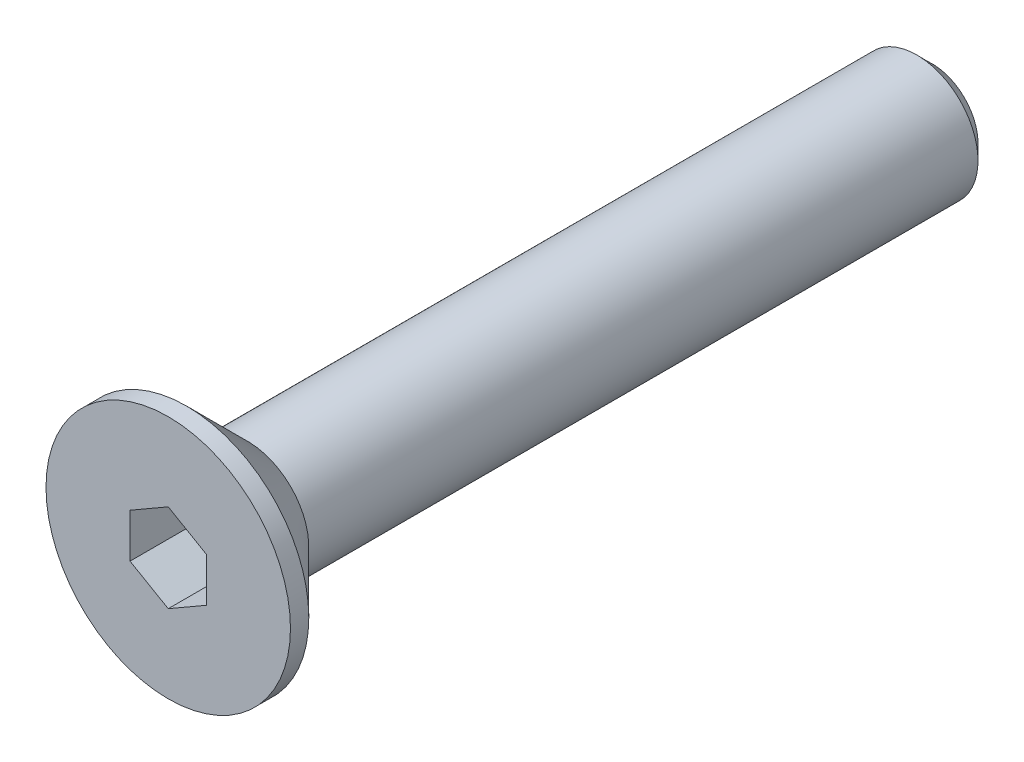
ISO-10303-21;
HEADER;
FILE_DESCRIPTION(('STEP AP214'),'2;1');
FILE_NAME('part.step','',(''),(''),'','','');
FILE_SCHEMA(('AUTOMOTIVE_DESIGN { 1 0 10303 214 1 1 1 1 }'));
ENDSEC;
DATA;
#1=APPLICATION_CONTEXT('core data for automotive mechanical design processes');
#2=APPLICATION_PROTOCOL_DEFINITION('international standard','automotive_design',2000,#1);
#3=PRODUCT_CONTEXT('',#1,'mechanical');
#4=PRODUCT('Part','Part','',(#3));
#5=PRODUCT_RELATED_PRODUCT_CATEGORY('part','',(#4));
#6=PRODUCT_DEFINITION_FORMATION('','',#4);
#7=PRODUCT_DEFINITION_CONTEXT('part definition',#1,'design');
#8=PRODUCT_DEFINITION('design','',#6,#7);
#9=PRODUCT_DEFINITION_SHAPE('','',#8);
#10=(LENGTH_UNIT() NAMED_UNIT(*) SI_UNIT(.MILLI.,.METRE.));
#11=(NAMED_UNIT(*) PLANE_ANGLE_UNIT() SI_UNIT($,.RADIAN.));
#12=(NAMED_UNIT(*) SI_UNIT($,.STERADIAN.) SOLID_ANGLE_UNIT());
#13=UNCERTAINTY_MEASURE_WITH_UNIT(LENGTH_MEASURE(1.E-05),#10,'distance_accuracy_value','');
#14=(GEOMETRIC_REPRESENTATION_CONTEXT(3) GLOBAL_UNCERTAINTY_ASSIGNED_CONTEXT((#13)) GLOBAL_UNIT_ASSIGNED_CONTEXT((#10,
#11,#12)) REPRESENTATION_CONTEXT('',''));
#15=CARTESIAN_POINT('',(0.,0.,0.));
#16=DIRECTION('',(0.,0.,1.));
#17=DIRECTION('',(1.,0.,0.));
#18=AXIS2_PLACEMENT_3D('',#15,#16,#17);
#19=CARTESIAN_POINT('',(0.,0.,12.5));
#20=DIRECTION('',(0.,0.,1.));
#21=DIRECTION('',(1.,0.,0.));
#22=AXIS2_PLACEMENT_3D('',#19,#20,#21);
#23=PLANE('',#22);
#24=DIRECTION('',(-0.866025403784439,0.5,0.));
#25=VECTOR('',#24,1.);
#26=CARTESIAN_POINT('',(1.25,0.721687836487034,12.5));
#27=LINE('',#26,#25);
#28=CARTESIAN_POINT('',(1.25,0.721687836487034,12.5));
#29=VERTEX_POINT('',#28);
#30=CARTESIAN_POINT('',(0.,1.44337567297407,12.5));
#31=VERTEX_POINT('',#30);
#32=EDGE_CURVE('E53',#29,#31,#27,.T.);
#33=ORIENTED_EDGE('',*,*,#32,.F.);
#34=DIRECTION('',(0.,1.,0.));
#35=VECTOR('',#34,1.);
#36=CARTESIAN_POINT('',(1.25,-0.721687836487031,12.5));
#37=LINE('',#36,#35);
#38=CARTESIAN_POINT('',(1.25,-0.721687836487031,12.5));
#39=VERTEX_POINT('',#38);
#40=EDGE_CURVE('E136',#39,#29,#37,.T.);
#41=ORIENTED_EDGE('',*,*,#40,.F.);
#42=DIRECTION('',(0.866025403784439,0.5,0.));
#43=VECTOR('',#42,1.);
#44=CARTESIAN_POINT('',(0.,-1.44337567297406,12.5));
#45=LINE('',#44,#43);
#46=CARTESIAN_POINT('',(0.,-1.44337567297406,12.5));
#47=VERTEX_POINT('',#46);
#48=EDGE_CURVE('E134',#47,#39,#45,.T.);
#49=ORIENTED_EDGE('',*,*,#48,.F.);
#50=DIRECTION('',(0.866025403784439,-0.5,0.));
#51=VECTOR('',#50,1.);
#52=CARTESIAN_POINT('',(-1.25,-0.721687836487031,12.5));
#53=LINE('',#52,#51);
#54=CARTESIAN_POINT('',(-1.25,-0.721687836487031,12.5));
#55=VERTEX_POINT('',#54);
#56=EDGE_CURVE('E101',#55,#47,#53,.T.);
#57=ORIENTED_EDGE('',*,*,#56,.F.);
#58=DIRECTION('',(0.,-1.,0.));
#59=VECTOR('',#58,1.);
#60=CARTESIAN_POINT('',(-1.25,0.721687836487034,12.5));
#61=LINE('',#60,#59);
#62=CARTESIAN_POINT('',(-1.25,0.721687836487034,12.5));
#63=VERTEX_POINT('',#62);
#64=EDGE_CURVE('E130',#63,#55,#61,.T.);
#65=ORIENTED_EDGE('',*,*,#64,.F.);
#66=DIRECTION('',(-0.866025403784439,-0.5,0.));
#67=VECTOR('',#66,1.);
#68=CARTESIAN_POINT('',(0.,1.44337567297407,12.5));
#69=LINE('',#68,#67);
#70=EDGE_CURVE('E127',#31,#63,#69,.T.);
#71=ORIENTED_EDGE('',*,*,#70,.F.);
#72=EDGE_LOOP('',(#33,#41,#49,#57,#65,#71));
#73=FACE_BOUND('',#72,.T.);
#74=CARTESIAN_POINT('',(0.,0.,12.5));
#75=DIRECTION('',(0.,0.,-1.));
#76=DIRECTION('',(-1.,0.,0.));
#77=AXIS2_PLACEMENT_3D('',#74,#75,#76);
#78=CIRCLE('',#77,4.);
#79=CARTESIAN_POINT('',(-4.,0.,12.5));
#80=VERTEX_POINT('',#79);
#81=EDGE_CURVE('E151',#80,#80,#78,.T.);
#82=ORIENTED_EDGE('',*,*,#81,.F.);
#83=EDGE_LOOP('',(#82));
#84=FACE_BOUND('',#83,.T.);
#85=ADVANCED_FACE('F37',(#73,#84),#23,.T.);
#86=CARTESIAN_POINT('',(0.,0.,-12.5));
#87=DIRECTION('',(0.,0.,-1.));
#88=DIRECTION('',(-1.,0.,0.));
#89=AXIS2_PLACEMENT_3D('',#86,#87,#88);
#90=CYLINDRICAL_SURFACE('',#89,4.);
#91=ORIENTED_EDGE('',*,*,#81,.T.);
#92=EDGE_LOOP('',(#91));
#93=FACE_BOUND('',#92,.T.);
#94=CARTESIAN_POINT('',(0.,0.,11.9));
#95=DIRECTION('',(0.,0.,-1.));
#96=DIRECTION('',(-1.,0.,0.));
#97=AXIS2_PLACEMENT_3D('',#94,#95,#96);
#98=CIRCLE('',#97,4.);
#99=CARTESIAN_POINT('',(-4.,0.,11.9));
#100=VERTEX_POINT('',#99);
#101=EDGE_CURVE('E148',#100,#100,#98,.T.);
#102=ORIENTED_EDGE('',*,*,#101,.F.);
#103=EDGE_LOOP('',(#102));
#104=FACE_BOUND('',#103,.T.);
#105=ADVANCED_FACE('F171',(#93,#104),#90,.T.);
#106=CARTESIAN_POINT('',(0.,0.,9.9));
#107=DIRECTION('',(0.,0.,1.));
#108=DIRECTION('',(1.,0.,0.));
#109=AXIS2_PLACEMENT_3D('',#106,#107,#108);
#110=CONICAL_SURFACE('',#109,2.,0.78539816339745);
#111=ORIENTED_EDGE('',*,*,#101,.T.);
#112=EDGE_LOOP('',(#111));
#113=FACE_BOUND('',#112,.T.);
#114=CARTESIAN_POINT('',(0.,0.,9.9));
#115=DIRECTION('',(0.,0.,-1.));
#116=DIRECTION('',(-1.,0.,0.));
#117=AXIS2_PLACEMENT_3D('',#114,#115,#116);
#118=CIRCLE('',#117,2.);
#119=CARTESIAN_POINT('',(-2.,0.,9.9));
#120=VERTEX_POINT('',#119);
#121=EDGE_CURVE('E140',#120,#120,#118,.T.);
#122=ORIENTED_EDGE('',*,*,#121,.F.);
#123=EDGE_LOOP('',(#122));
#124=FACE_BOUND('',#123,.T.);
#125=ADVANCED_FACE('F176',(#113,#124),#110,.T.);
#126=CARTESIAN_POINT('',(0.,0.,-12.5));
#127=DIRECTION('',(0.,0.,-1.));
#128=DIRECTION('',(-1.,0.,0.));
#129=AXIS2_PLACEMENT_3D('',#126,#127,#128);
#130=CYLINDRICAL_SURFACE('',#129,2.);
#131=CARTESIAN_POINT('',(0.,0.,-12.));
#132=DIRECTION('',(0.,0.,-1.));
#133=DIRECTION('',(-1.,0.,0.));
#134=AXIS2_PLACEMENT_3D('',#131,#132,#133);
#135=CIRCLE('',#134,2.);
#136=CARTESIAN_POINT('',(-2.,0.,-12.));
#137=VERTEX_POINT('',#136);
#138=EDGE_CURVE('E11',#137,#137,#135,.F.);
#139=ORIENTED_EDGE('',*,*,#138,.T.);
#140=EDGE_LOOP('',(#139));
#141=FACE_BOUND('',#140,.T.);
#142=ORIENTED_EDGE('',*,*,#121,.T.);
#143=EDGE_LOOP('',(#142));
#144=FACE_BOUND('',#143,.T.);
#145=ADVANCED_FACE('F167',(#141,#144),#130,.T.);
#146=CARTESIAN_POINT('',(0.,2.,-12.5));
#147=DIRECTION('',(0.,0.,-1.));
#148=DIRECTION('',(-1.,0.,0.));
#149=AXIS2_PLACEMENT_3D('',#146,#147,#148);
#150=PLANE('',#149);
#151=CARTESIAN_POINT('',(0.,0.,-12.5));
#152=DIRECTION('',(0.,0.,-1.));
#153=DIRECTION('',(-1.,0.,0.));
#154=AXIS2_PLACEMENT_3D('',#151,#152,#153);
#155=CIRCLE('',#154,1.5);
#156=CARTESIAN_POINT('',(-1.5,0.,-12.5));
#157=VERTEX_POINT('',#156);
#158=EDGE_CURVE('E46',#157,#157,#155,.T.);
#159=ORIENTED_EDGE('',*,*,#158,.T.);
#160=EDGE_LOOP('',(#159));
#161=FACE_BOUND('',#160,.T.);
#162=ADVANCED_FACE('F156',(#161),#150,.T.);
#163=CARTESIAN_POINT('',(0.,0.,-12.5));
#164=DIRECTION('',(0.,0.,1.));
#165=DIRECTION('',(1.,0.,0.));
#166=AXIS2_PLACEMENT_3D('',#163,#164,#165);
#167=CONICAL_SURFACE('',#166,1.5,0.785398163397444);
#168=ORIENTED_EDGE('',*,*,#138,.F.);
#169=EDGE_LOOP('',(#168));
#170=FACE_BOUND('',#169,.T.);
#171=ORIENTED_EDGE('',*,*,#158,.F.);
#172=EDGE_LOOP('',(#171));
#173=FACE_BOUND('',#172,.T.);
#174=ADVANCED_FACE('F40',(#170,#173),#167,.T.);
#175=CARTESIAN_POINT('',(1.25,0.721687836487034,10.));
#176=DIRECTION('',(0.5,0.866025403784439,0.));
#177=DIRECTION('',(-0.866025403784439,0.5,0.));
#178=AXIS2_PLACEMENT_3D('',#175,#176,#177);
#179=PLANE('',#178);
#180=ORIENTED_EDGE('',*,*,#32,.T.);
#181=DIRECTION('',(0.,0.,1.));
#182=VECTOR('',#181,1.);
#183=CARTESIAN_POINT('',(0.,1.44337567297407,10.));
#184=LINE('',#183,#182);
#185=CARTESIAN_POINT('',(0.,1.44337567297407,10.));
#186=VERTEX_POINT('',#185);
#187=EDGE_CURVE('E83',#186,#31,#184,.T.);
#188=ORIENTED_EDGE('',*,*,#187,.F.);
#189=DIRECTION('',(-0.866025403784439,0.5,0.));
#190=VECTOR('',#189,1.);
#191=CARTESIAN_POINT('',(1.25,0.721687836487034,10.));
#192=LINE('',#191,#190);
#193=CARTESIAN_POINT('',(1.25,0.721687836487034,10.));
#194=VERTEX_POINT('',#193);
#195=EDGE_CURVE('E138',#194,#186,#192,.T.);
#196=ORIENTED_EDGE('',*,*,#195,.F.);
#197=DIRECTION('',(0.,0.,1.));
#198=VECTOR('',#197,1.);
#199=CARTESIAN_POINT('',(1.25,0.721687836487034,10.));
#200=LINE('',#199,#198);
#201=EDGE_CURVE('E61',#194,#29,#200,.T.);
#202=ORIENTED_EDGE('',*,*,#201,.T.);
#203=EDGE_LOOP('',(#180,#188,#196,#202));
#204=FACE_BOUND('',#203,.T.);
#205=ADVANCED_FACE('F159',(#204),#179,.F.);
#206=CARTESIAN_POINT('',(1.25,-0.721687836487031,10.));
#207=DIRECTION('',(1.,0.,0.));
#208=DIRECTION('',(0.,1.,0.));
#209=AXIS2_PLACEMENT_3D('',#206,#207,#208);
#210=PLANE('',#209);
#211=ORIENTED_EDGE('',*,*,#40,.T.);
#212=ORIENTED_EDGE('',*,*,#201,.F.);
#213=DIRECTION('',(0.,1.,0.));
#214=VECTOR('',#213,1.);
#215=CARTESIAN_POINT('',(1.25,-0.721687836487031,10.));
#216=LINE('',#215,#214);
#217=CARTESIAN_POINT('',(1.25,-0.721687836487031,10.));
#218=VERTEX_POINT('',#217);
#219=EDGE_CURVE('E113',#218,#194,#216,.T.);
#220=ORIENTED_EDGE('',*,*,#219,.F.);
#221=DIRECTION('',(0.,0.,1.));
#222=VECTOR('',#221,1.);
#223=CARTESIAN_POINT('',(1.25,-0.721687836487031,10.));
#224=LINE('',#223,#222);
#225=EDGE_CURVE('E105',#218,#39,#224,.T.);
#226=ORIENTED_EDGE('',*,*,#225,.T.);
#227=EDGE_LOOP('',(#211,#212,#220,#226));
#228=FACE_BOUND('',#227,.T.);
#229=ADVANCED_FACE('F165',(#228),#210,.F.);
#230=CARTESIAN_POINT('',(0.,-1.44337567297406,10.));
#231=DIRECTION('',(0.5,-0.866025403784439,0.));
#232=DIRECTION('',(0.866025403784439,0.5,0.));
#233=AXIS2_PLACEMENT_3D('',#230,#231,#232);
#234=PLANE('',#233);
#235=ORIENTED_EDGE('',*,*,#48,.T.);
#236=ORIENTED_EDGE('',*,*,#225,.F.);
#237=DIRECTION('',(0.866025403784439,0.5,0.));
#238=VECTOR('',#237,1.);
#239=CARTESIAN_POINT('',(0.,-1.44337567297406,10.));
#240=LINE('',#239,#238);
#241=CARTESIAN_POINT('',(0.,-1.44337567297406,10.));
#242=VERTEX_POINT('',#241);
#243=EDGE_CURVE('E109',#242,#218,#240,.T.);
#244=ORIENTED_EDGE('',*,*,#243,.F.);
#245=DIRECTION('',(0.,0.,1.));
#246=VECTOR('',#245,1.);
#247=CARTESIAN_POINT('',(0.,-1.44337567297406,10.));
#248=LINE('',#247,#246);
#249=EDGE_CURVE('E94',#242,#47,#248,.T.);
#250=ORIENTED_EDGE('',*,*,#249,.T.);
#251=EDGE_LOOP('',(#235,#236,#244,#250));
#252=FACE_BOUND('',#251,.T.);
#253=ADVANCED_FACE('F110',(#252),#234,.F.);
#254=CARTESIAN_POINT('',(-1.25,-0.721687836487031,10.));
#255=DIRECTION('',(-0.5,-0.866025403784438,0.));
#256=DIRECTION('',(0.866025403784439,-0.5,0.));
#257=AXIS2_PLACEMENT_3D('',#254,#255,#256);
#258=PLANE('',#257);
#259=ORIENTED_EDGE('',*,*,#56,.T.);
#260=ORIENTED_EDGE('',*,*,#249,.F.);
#261=DIRECTION('',(0.866025403784439,-0.5,0.));
#262=VECTOR('',#261,1.);
#263=CARTESIAN_POINT('',(-1.25,-0.721687836487031,10.));
#264=LINE('',#263,#262);
#265=CARTESIAN_POINT('',(-1.25,-0.721687836487031,10.));
#266=VERTEX_POINT('',#265);
#267=EDGE_CURVE('E98',#266,#242,#264,.T.);
#268=ORIENTED_EDGE('',*,*,#267,.F.);
#269=DIRECTION('',(0.,0.,1.));
#270=VECTOR('',#269,1.);
#271=CARTESIAN_POINT('',(-1.25,-0.721687836487031,10.));
#272=LINE('',#271,#270);
#273=EDGE_CURVE('E106',#266,#55,#272,.T.);
#274=ORIENTED_EDGE('',*,*,#273,.T.);
#275=EDGE_LOOP('',(#259,#260,#268,#274));
#276=FACE_BOUND('',#275,.T.);
#277=ADVANCED_FACE('F96',(#276),#258,.F.);
#278=CARTESIAN_POINT('',(-1.25,0.721687836487034,10.));
#279=DIRECTION('',(-1.,0.,0.));
#280=DIRECTION('',(0.,0.,1.));
#281=AXIS2_PLACEMENT_3D('',#278,#279,#280);
#282=PLANE('',#281);
#283=ORIENTED_EDGE('',*,*,#64,.T.);
#284=ORIENTED_EDGE('',*,*,#273,.F.);
#285=DIRECTION('',(0.,-1.,0.));
#286=VECTOR('',#285,1.);
#287=CARTESIAN_POINT('',(-1.25,0.721687836487034,10.));
#288=LINE('',#287,#286);
#289=CARTESIAN_POINT('',(-1.25,0.721687836487034,10.));
#290=VERTEX_POINT('',#289);
#291=EDGE_CURVE('E119',#290,#266,#288,.T.);
#292=ORIENTED_EDGE('',*,*,#291,.F.);
#293=DIRECTION('',(0.,0.,1.));
#294=VECTOR('',#293,1.);
#295=CARTESIAN_POINT('',(-1.25,0.721687836487034,10.));
#296=LINE('',#295,#294);
#297=EDGE_CURVE('E143',#290,#63,#296,.T.);
#298=ORIENTED_EDGE('',*,*,#297,.T.);
#299=EDGE_LOOP('',(#283,#284,#292,#298));
#300=FACE_BOUND('',#299,.T.);
#301=ADVANCED_FACE('F190',(#300),#282,.F.);
#302=CARTESIAN_POINT('',(0.,1.44337567297407,10.));
#303=DIRECTION('',(-0.5,0.866025403784439,0.));
#304=DIRECTION('',(-0.866025403784439,-0.5,0.));
#305=AXIS2_PLACEMENT_3D('',#302,#303,#304);
#306=PLANE('',#305);
#307=ORIENTED_EDGE('',*,*,#70,.T.);
#308=ORIENTED_EDGE('',*,*,#297,.F.);
#309=DIRECTION('',(-0.866025403784439,-0.5,0.));
#310=VECTOR('',#309,1.);
#311=CARTESIAN_POINT('',(0.,1.44337567297407,10.));
#312=LINE('',#311,#310);
#313=EDGE_CURVE('E121',#186,#290,#312,.T.);
#314=ORIENTED_EDGE('',*,*,#313,.F.);
#315=ORIENTED_EDGE('',*,*,#187,.T.);
#316=EDGE_LOOP('',(#307,#308,#314,#315));
#317=FACE_BOUND('',#316,.T.);
#318=ADVANCED_FACE('F187',(#317),#306,.F.);
#319=CARTESIAN_POINT('',(0.,0.,10.));
#320=DIRECTION('',(0.,0.,1.));
#321=DIRECTION('',(1.,0.,0.));
#322=AXIS2_PLACEMENT_3D('',#319,#320,#321);
#323=PLANE('',#322);
#324=ORIENTED_EDGE('',*,*,#195,.T.);
#325=ORIENTED_EDGE('',*,*,#313,.T.);
#326=ORIENTED_EDGE('',*,*,#291,.T.);
#327=ORIENTED_EDGE('',*,*,#267,.T.);
#328=ORIENTED_EDGE('',*,*,#243,.T.);
#329=ORIENTED_EDGE('',*,*,#219,.T.);
#330=EDGE_LOOP('',(#324,#325,#326,#327,#328,#329));
#331=FACE_BOUND('',#330,.T.);
#332=ADVANCED_FACE('F116',(#331),#323,.T.);
#333=CLOSED_SHELL('',(#85,#105,#125,#145,#162,#174,#205,#229,#253,#277,#301,#318,#332));
#334=MANIFOLD_SOLID_BREP('B2',#333);
#335=ADVANCED_BREP_SHAPE_REPRESENTATION('',(#18,#334),#14);
#336=SHAPE_DEFINITION_REPRESENTATION(#9,#335);
ENDSEC;
END-ISO-10303-21;
